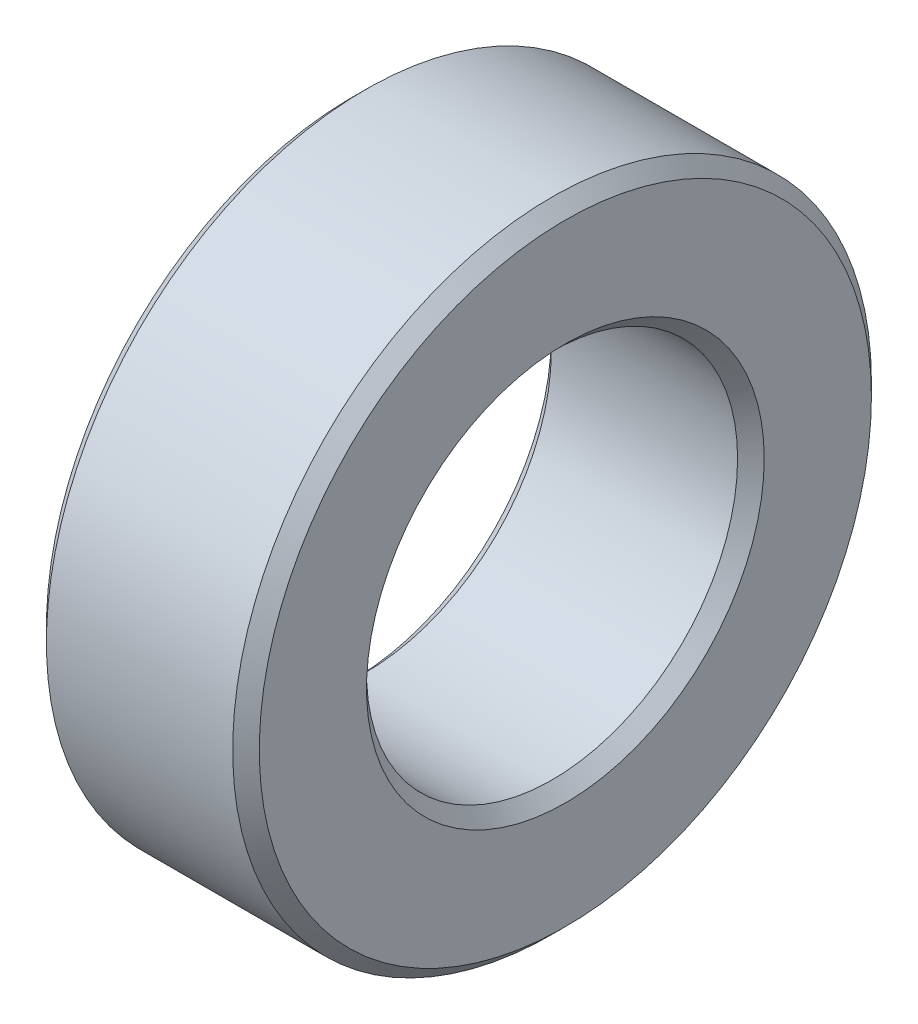
ISO-10303-21;
HEADER;
FILE_DESCRIPTION(('STEP AP214'),'2;1');
FILE_NAME('part.step','',(''),(''),'','','');
FILE_SCHEMA(('AUTOMOTIVE_DESIGN { 1 0 10303 214 1 1 1 1 }'));
ENDSEC;
DATA;
#1=APPLICATION_CONTEXT('core data for automotive mechanical design processes');
#2=APPLICATION_PROTOCOL_DEFINITION('international standard','automotive_design',2000,#1);
#3=PRODUCT_CONTEXT('',#1,'mechanical');
#4=PRODUCT('Part','Part','',(#3));
#5=PRODUCT_RELATED_PRODUCT_CATEGORY('part','',(#4));
#6=PRODUCT_DEFINITION_FORMATION('','',#4);
#7=PRODUCT_DEFINITION_CONTEXT('part definition',#1,'design');
#8=PRODUCT_DEFINITION('design','',#6,#7);
#9=PRODUCT_DEFINITION_SHAPE('','',#8);
#10=(LENGTH_UNIT() NAMED_UNIT(*) SI_UNIT(.MILLI.,.METRE.));
#11=(NAMED_UNIT(*) PLANE_ANGLE_UNIT() SI_UNIT($,.RADIAN.));
#12=(NAMED_UNIT(*) SI_UNIT($,.STERADIAN.) SOLID_ANGLE_UNIT());
#13=UNCERTAINTY_MEASURE_WITH_UNIT(LENGTH_MEASURE(1.E-05),#10,'distance_accuracy_value','');
#14=(GEOMETRIC_REPRESENTATION_CONTEXT(3) GLOBAL_UNCERTAINTY_ASSIGNED_CONTEXT((#13)) GLOBAL_UNIT_ASSIGNED_CONTEXT((#10,
#11,#12)) REPRESENTATION_CONTEXT('',''));
#15=CARTESIAN_POINT('',(0.,0.,0.));
#16=DIRECTION('',(0.,0.,1.));
#17=DIRECTION('',(1.,0.,0.));
#18=AXIS2_PLACEMENT_3D('',#15,#16,#17);
#19=CARTESIAN_POINT('',(4.,0.,0.));
#20=DIRECTION('',(1.,0.,0.));
#21=DIRECTION('',(0.,0.,-1.));
#22=AXIS2_PLACEMENT_3D('',#19,#20,#21);
#23=PLANE('',#22);
#24=CARTESIAN_POINT('',(4.,0.,0.));
#25=DIRECTION('',(1.,0.,0.));
#26=DIRECTION('',(0.,0.,-1.));
#27=AXIS2_PLACEMENT_3D('',#24,#25,#26);
#28=CIRCLE('',#27,5.75);
#29=CARTESIAN_POINT('',(4.,0.,-5.75));
#30=VERTEX_POINT('',#29);
#31=EDGE_CURVE('E283',#30,#30,#28,.T.);
#32=ORIENTED_EDGE('',*,*,#31,.T.);
#33=EDGE_LOOP('',(#32));
#34=FACE_BOUND('',#33,.T.);
#35=CARTESIAN_POINT('',(4.,0.,0.));
#36=DIRECTION('',(1.,0.,0.));
#37=DIRECTION('',(0.,0.,-1.));
#38=AXIS2_PLACEMENT_3D('',#35,#36,#37);
#39=CIRCLE('',#38,3.73600000000001);
#40=CARTESIAN_POINT('',(4.,0.,-3.73600000000001));
#41=VERTEX_POINT('',#40);
#42=EDGE_CURVE('E286',#41,#41,#39,.F.);
#43=ORIENTED_EDGE('',*,*,#42,.T.);
#44=EDGE_LOOP('',(#43));
#45=FACE_BOUND('',#44,.T.);
#46=ADVANCED_FACE('F257',(#34,#45),#23,.T.);
#47=CARTESIAN_POINT('',(0.,0.,0.));
#48=DIRECTION('',(1.,0.,0.));
#49=DIRECTION('',(0.,0.,-1.));
#50=AXIS2_PLACEMENT_3D('',#47,#48,#49);
#51=PLANE('',#50);
#52=CARTESIAN_POINT('',(0.,0.,0.));
#53=DIRECTION('',(1.,0.,0.));
#54=DIRECTION('',(0.,0.,-1.));
#55=AXIS2_PLACEMENT_3D('',#52,#53,#54);
#56=CIRCLE('',#55,5.75);
#57=CARTESIAN_POINT('',(0.,0.,-5.75));
#58=VERTEX_POINT('',#57);
#59=EDGE_CURVE('E268',#58,#58,#56,.F.);
#60=ORIENTED_EDGE('',*,*,#59,.T.);
#61=EDGE_LOOP('',(#60));
#62=FACE_BOUND('',#61,.T.);
#63=CARTESIAN_POINT('',(0.,0.,0.));
#64=DIRECTION('',(1.,0.,0.));
#65=DIRECTION('',(0.,0.,-1.));
#66=AXIS2_PLACEMENT_3D('',#63,#64,#65);
#67=CIRCLE('',#66,3.736);
#68=CARTESIAN_POINT('',(0.,0.,-3.736));
#69=VERTEX_POINT('',#68);
#70=EDGE_CURVE('E272',#69,#69,#67,.T.);
#71=ORIENTED_EDGE('',*,*,#70,.T.);
#72=EDGE_LOOP('',(#71));
#73=FACE_BOUND('',#72,.T.);
#74=ADVANCED_FACE('F300',(#62,#73),#51,.F.);
#75=CARTESIAN_POINT('',(4.,0.,0.));
#76=DIRECTION('',(-1.,0.,0.));
#77=DIRECTION('',(0.,0.,1.));
#78=AXIS2_PLACEMENT_3D('',#75,#76,#77);
#79=CYLINDRICAL_SURFACE('',#78,6.);
#80=CARTESIAN_POINT('',(3.75,0.,0.));
#81=DIRECTION('',(1.,0.,0.));
#82=DIRECTION('',(0.,0.,-1.));
#83=AXIS2_PLACEMENT_3D('',#80,#81,#82);
#84=CIRCLE('',#83,6.);
#85=CARTESIAN_POINT('',(3.75,0.,-6.));
#86=VERTEX_POINT('',#85);
#87=EDGE_CURVE('E277',#86,#86,#84,.F.);
#88=ORIENTED_EDGE('',*,*,#87,.T.);
#89=EDGE_LOOP('',(#88));
#90=FACE_BOUND('',#89,.T.);
#91=CARTESIAN_POINT('',(0.250000000000004,0.,0.));
#92=DIRECTION('',(1.,0.,0.));
#93=DIRECTION('',(0.,0.,-1.));
#94=AXIS2_PLACEMENT_3D('',#91,#92,#93);
#95=CIRCLE('',#94,6.);
#96=CARTESIAN_POINT('',(0.250000000000004,0.,-6.));
#97=VERTEX_POINT('',#96);
#98=EDGE_CURVE('E280',#97,#97,#95,.T.);
#99=ORIENTED_EDGE('',*,*,#98,.T.);
#100=EDGE_LOOP('',(#99));
#101=FACE_BOUND('',#100,.T.);
#102=ADVANCED_FACE('F306',(#90,#101),#79,.T.);
#103=CARTESIAN_POINT('',(4.,0.,0.));
#104=DIRECTION('',(-1.,0.,0.));
#105=DIRECTION('',(0.,0.,1.));
#106=AXIS2_PLACEMENT_3D('',#103,#104,#105);
#107=CYLINDRICAL_SURFACE('',#106,3.486);
#108=CARTESIAN_POINT('',(0.25,0.,0.));
#109=DIRECTION('',(1.,0.,0.));
#110=DIRECTION('',(0.,0.,-1.));
#111=AXIS2_PLACEMENT_3D('',#108,#109,#110);
#112=CIRCLE('',#111,3.486);
#113=CARTESIAN_POINT('',(0.25,0.,-3.486));
#114=VERTEX_POINT('',#113);
#115=EDGE_CURVE('E11',#114,#114,#112,.F.);
#116=ORIENTED_EDGE('',*,*,#115,.T.);
#117=EDGE_LOOP('',(#116));
#118=FACE_BOUND('',#117,.T.);
#119=CARTESIAN_POINT('',(3.75,0.,0.));
#120=DIRECTION('',(1.,0.,0.));
#121=DIRECTION('',(0.,0.,-1.));
#122=AXIS2_PLACEMENT_3D('',#119,#120,#121);
#123=CIRCLE('',#122,3.486);
#124=CARTESIAN_POINT('',(3.75,0.,-3.486));
#125=VERTEX_POINT('',#124);
#126=EDGE_CURVE('E264',#125,#125,#123,.T.);
#127=ORIENTED_EDGE('',*,*,#126,.T.);
#128=EDGE_LOOP('',(#127));
#129=FACE_BOUND('',#128,.T.);
#130=ADVANCED_FACE('F310',(#118,#129),#107,.F.);
#131=CARTESIAN_POINT('',(4.,0.,0.));
#132=DIRECTION('',(-1.,0.,0.));
#133=DIRECTION('',(0.,0.,1.));
#134=AXIS2_PLACEMENT_3D('',#131,#132,#133);
#135=CONICAL_SURFACE('',#134,5.75,0.785398163397447);
#136=ORIENTED_EDGE('',*,*,#87,.F.);
#137=EDGE_LOOP('',(#136));
#138=FACE_BOUND('',#137,.T.);
#139=ORIENTED_EDGE('',*,*,#31,.F.);
#140=EDGE_LOOP('',(#139));
#141=FACE_BOUND('',#140,.T.);
#142=ADVANCED_FACE('F315',(#138,#141),#135,.T.);
#143=CARTESIAN_POINT('',(0.250000000000004,0.,0.));
#144=DIRECTION('',(1.,0.,0.));
#145=DIRECTION('',(0.,0.,-1.));
#146=AXIS2_PLACEMENT_3D('',#143,#144,#145);
#147=CONICAL_SURFACE('',#146,6.,0.78539816339745);
#148=ORIENTED_EDGE('',*,*,#59,.F.);
#149=EDGE_LOOP('',(#148));
#150=FACE_BOUND('',#149,.T.);
#151=ORIENTED_EDGE('',*,*,#98,.F.);
#152=EDGE_LOOP('',(#151));
#153=FACE_BOUND('',#152,.T.);
#154=ADVANCED_FACE('F297',(#150,#153),#147,.T.);
#155=CARTESIAN_POINT('',(0.,0.,0.));
#156=DIRECTION('',(-1.,0.,0.));
#157=DIRECTION('',(0.,0.,1.));
#158=AXIS2_PLACEMENT_3D('',#155,#156,#157);
#159=CONICAL_SURFACE('',#158,3.736,0.785398163397447);
#160=ORIENTED_EDGE('',*,*,#115,.F.);
#161=EDGE_LOOP('',(#160));
#162=FACE_BOUND('',#161,.T.);
#163=ORIENTED_EDGE('',*,*,#70,.F.);
#164=EDGE_LOOP('',(#163));
#165=FACE_BOUND('',#164,.T.);
#166=ADVANCED_FACE('F293',(#162,#165),#159,.F.);
#167=CARTESIAN_POINT('',(3.75,0.,0.));
#168=DIRECTION('',(1.,0.,0.));
#169=DIRECTION('',(0.,0.,-1.));
#170=AXIS2_PLACEMENT_3D('',#167,#168,#169);
#171=CONICAL_SURFACE('',#170,3.486,0.785398163397448);
#172=ORIENTED_EDGE('',*,*,#42,.F.);
#173=EDGE_LOOP('',(#172));
#174=FACE_BOUND('',#173,.T.);
#175=ORIENTED_EDGE('',*,*,#126,.F.);
#176=EDGE_LOOP('',(#175));
#177=FACE_BOUND('',#176,.T.);
#178=ADVANCED_FACE('F259',(#174,#177),#171,.F.);
#179=CLOSED_SHELL('',(#46,#74,#102,#130,#142,#154,#166,#178));
#180=MANIFOLD_SOLID_BREP('B2',#179);
#181=ADVANCED_BREP_SHAPE_REPRESENTATION('',(#18,#180),#14);
#182=SHAPE_DEFINITION_REPRESENTATION(#9,#181);
ENDSEC;
END-ISO-10303-21;
